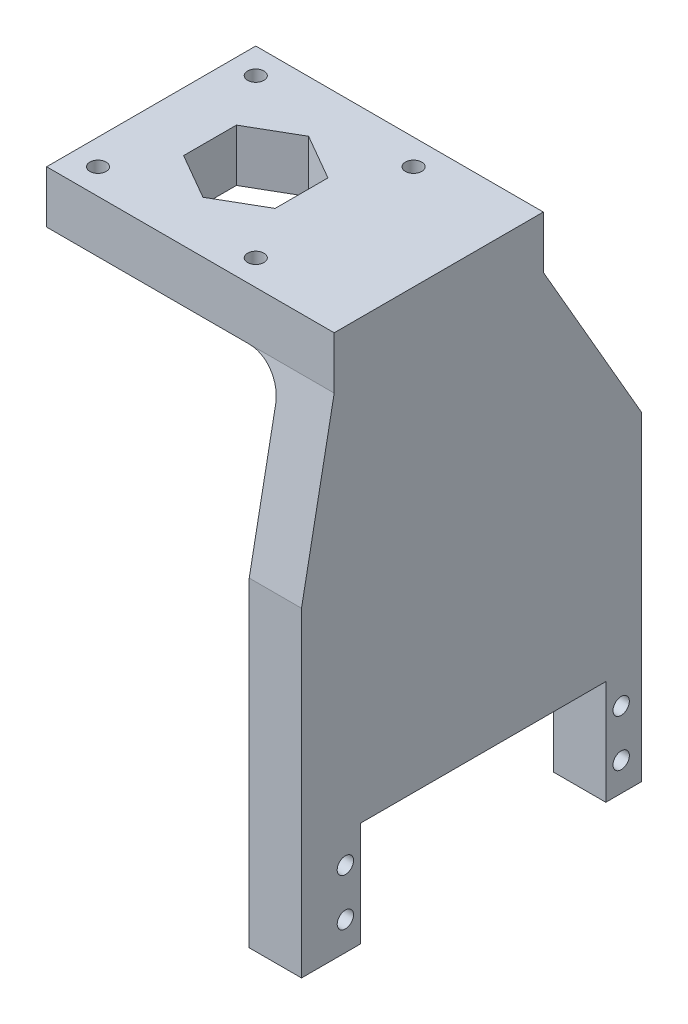
ISO-10303-21;
HEADER;
FILE_DESCRIPTION(('STEP AP214'),'2;1');
FILE_NAME('part.step','',(''),(''),'','','');
FILE_SCHEMA(('AUTOMOTIVE_DESIGN { 1 0 10303 214 1 1 1 1 }'));
ENDSEC;
DATA;
#1=APPLICATION_CONTEXT('core data for automotive mechanical design processes');
#2=APPLICATION_PROTOCOL_DEFINITION('international standard','automotive_design',2000,#1);
#3=PRODUCT_CONTEXT('',#1,'mechanical');
#4=PRODUCT('Part','Part','',(#3));
#5=PRODUCT_RELATED_PRODUCT_CATEGORY('part','',(#4));
#6=PRODUCT_DEFINITION_FORMATION('','',#4);
#7=PRODUCT_DEFINITION_CONTEXT('part definition',#1,'design');
#8=PRODUCT_DEFINITION('design','',#6,#7);
#9=PRODUCT_DEFINITION_SHAPE('','',#8);
#10=(LENGTH_UNIT() NAMED_UNIT(*) SI_UNIT(.MILLI.,.METRE.));
#11=(NAMED_UNIT(*) PLANE_ANGLE_UNIT() SI_UNIT($,.RADIAN.));
#12=(NAMED_UNIT(*) SI_UNIT($,.STERADIAN.) SOLID_ANGLE_UNIT());
#13=UNCERTAINTY_MEASURE_WITH_UNIT(LENGTH_MEASURE(1.E-05),#10,'distance_accuracy_value','');
#14=(GEOMETRIC_REPRESENTATION_CONTEXT(3) GLOBAL_UNCERTAINTY_ASSIGNED_CONTEXT((#13)) GLOBAL_UNIT_ASSIGNED_CONTEXT((#10,
#11,#12)) REPRESENTATION_CONTEXT('',''));
#15=CARTESIAN_POINT('',(0.,0.,0.));
#16=DIRECTION('',(0.,0.,1.));
#17=DIRECTION('',(1.,0.,0.));
#18=AXIS2_PLACEMENT_3D('',#15,#16,#17);
#19=CARTESIAN_POINT('',(0.,-75.,31.));
#20=DIRECTION('',(0.,1.,0.));
#21=DIRECTION('',(0.,0.,1.));
#22=AXIS2_PLACEMENT_3D('',#19,#20,#21);
#23=PLANE('',#22);
#24=DIRECTION('',(0.,0.,-1.));
#25=VECTOR('',#24,1.);
#26=CARTESIAN_POINT('',(8.00000000000001,-75.,31.));
#27=LINE('',#26,#25);
#28=CARTESIAN_POINT('',(8.00000000000001,-75.,21.));
#29=VERTEX_POINT('',#28);
#30=CARTESIAN_POINT('',(8.00000000000001,-75.,11.94));
#31=VERTEX_POINT('',#30);
#32=EDGE_CURVE('E358',#29,#31,#27,.T.);
#33=ORIENTED_EDGE('',*,*,#32,.F.);
#34=DIRECTION('',(-1.,0.,0.));
#35=VECTOR('',#34,1.);
#36=CARTESIAN_POINT('',(8.00100000000002,-75.,21.));
#37=LINE('',#36,#35);
#38=CARTESIAN_POINT('',(0.,-75.,21.));
#39=VERTEX_POINT('',#38);
#40=EDGE_CURVE('E187',#29,#39,#37,.T.);
#41=ORIENTED_EDGE('',*,*,#40,.T.);
#42=DIRECTION('',(0.,0.,-1.));
#43=VECTOR('',#42,1.);
#44=CARTESIAN_POINT('',(0.,-75.,31.));
#45=LINE('',#44,#43);
#46=CARTESIAN_POINT('',(0.,-75.,11.94));
#47=VERTEX_POINT('',#46);
#48=EDGE_CURVE('E361',#39,#47,#45,.T.);
#49=ORIENTED_EDGE('',*,*,#48,.T.);
#50=DIRECTION('',(-1.,0.,0.));
#51=VECTOR('',#50,1.);
#52=CARTESIAN_POINT('',(8.00100000000002,-75.,11.94));
#53=LINE('',#52,#51);
#54=EDGE_CURVE('E263',#31,#47,#53,.T.);
#55=ORIENTED_EDGE('',*,*,#54,.F.);
#56=EDGE_LOOP('',(#33,#41,#49,#55));
#57=FACE_BOUND('',#56,.T.);
#58=ADVANCED_FACE('F33',(#57),#23,.F.);
#59=CARTESIAN_POINT('',(-36.,8.,31.));
#60=DIRECTION('',(1.,0.,0.));
#61=DIRECTION('',(0.,0.,-1.));
#62=AXIS2_PLACEMENT_3D('',#59,#60,#61);
#63=PLANE('',#62);
#64=DIRECTION('',(0.,0.,-1.));
#65=VECTOR('',#64,1.);
#66=CARTESIAN_POINT('',(-36.,0.,31.));
#67=LINE('',#66,#65);
#68=CARTESIAN_POINT('',(-36.,0.,16.));
#69=VERTEX_POINT('',#68);
#70=CARTESIAN_POINT('',(-36.,0.,-16.));
#71=VERTEX_POINT('',#70);
#72=EDGE_CURVE('E363',#69,#71,#67,.T.);
#73=ORIENTED_EDGE('',*,*,#72,.F.);
#74=DIRECTION('',(0.,-1.,0.));
#75=VECTOR('',#74,1.);
#76=CARTESIAN_POINT('',(-36.,8.001,16.));
#77=LINE('',#76,#75);
#78=CARTESIAN_POINT('',(-36.,8.,16.));
#79=VERTEX_POINT('',#78);
#80=EDGE_CURVE('E213',#79,#69,#77,.T.);
#81=ORIENTED_EDGE('',*,*,#80,.F.);
#82=DIRECTION('',(0.,0.,-1.));
#83=VECTOR('',#82,1.);
#84=CARTESIAN_POINT('',(-36.,8.,31.));
#85=LINE('',#84,#83);
#86=CARTESIAN_POINT('',(-36.,8.,-16.));
#87=VERTEX_POINT('',#86);
#88=EDGE_CURVE('E354',#79,#87,#85,.T.);
#89=ORIENTED_EDGE('',*,*,#88,.T.);
#90=DIRECTION('',(0.,-1.,0.));
#91=VECTOR('',#90,1.);
#92=CARTESIAN_POINT('',(-36.,8.001,-16.));
#93=LINE('',#92,#91);
#94=EDGE_CURVE('E219',#87,#71,#93,.T.);
#95=ORIENTED_EDGE('',*,*,#94,.T.);
#96=EDGE_LOOP('',(#73,#81,#89,#95));
#97=FACE_BOUND('',#96,.T.);
#98=ADVANCED_FACE('F388',(#97),#63,.F.);
#99=CARTESIAN_POINT('',(-36.,0.,31.));
#100=DIRECTION('',(0.,1.,0.));
#101=DIRECTION('',(0.,0.,1.));
#102=AXIS2_PLACEMENT_3D('',#99,#100,#101);
#103=PLANE('',#102);
#104=CARTESIAN_POINT('',(-7.92968724514564,0.,12.0703127548544));
#105=DIRECTION('',(0.,1.,0.));
#106=DIRECTION('',(0.,0.,1.));
#107=AXIS2_PLACEMENT_3D('',#104,#105,#106);
#108=CIRCLE('',#107,1.25);
#109=CARTESIAN_POINT('',(-7.92968724514564,0.,13.3203127548544));
#110=VERTEX_POINT('',#109);
#111=EDGE_CURVE('E278',#110,#110,#108,.F.);
#112=ORIENTED_EDGE('',*,*,#111,.F.);
#113=EDGE_LOOP('',(#112));
#114=FACE_BOUND('',#113,.T.);
#115=CARTESIAN_POINT('',(-7.92968724514564,0.,-12.0703127548544));
#116=DIRECTION('',(0.,1.,0.));
#117=DIRECTION('',(0.,0.,1.));
#118=AXIS2_PLACEMENT_3D('',#115,#116,#117);
#119=CIRCLE('',#118,1.25);
#120=CARTESIAN_POINT('',(-7.92968724514564,0.,-10.8203127548544));
#121=VERTEX_POINT('',#120);
#122=EDGE_CURVE('E284',#121,#121,#119,.F.);
#123=ORIENTED_EDGE('',*,*,#122,.F.);
#124=EDGE_LOOP('',(#123));
#125=FACE_BOUND('',#124,.T.);
#126=CARTESIAN_POINT('',(-32.0703127548544,0.,-12.0703127548544));
#127=DIRECTION('',(0.,1.,0.));
#128=DIRECTION('',(0.,0.,1.));
#129=AXIS2_PLACEMENT_3D('',#126,#127,#128);
#130=CIRCLE('',#129,1.25);
#131=CARTESIAN_POINT('',(-32.0703127548544,0.,-10.8203127548544));
#132=VERTEX_POINT('',#131);
#133=EDGE_CURVE('E290',#132,#132,#130,.F.);
#134=ORIENTED_EDGE('',*,*,#133,.F.);
#135=EDGE_LOOP('',(#134));
#136=FACE_BOUND('',#135,.T.);
#137=CARTESIAN_POINT('',(-32.0703127548544,0.,12.0703127548544));
#138=DIRECTION('',(0.,1.,0.));
#139=DIRECTION('',(0.,0.,1.));
#140=AXIS2_PLACEMENT_3D('',#137,#138,#139);
#141=CIRCLE('',#140,1.25);
#142=CARTESIAN_POINT('',(-32.0703127548544,0.,13.3203127548544));
#143=VERTEX_POINT('',#142);
#144=EDGE_CURVE('E296',#143,#143,#141,.F.);
#145=ORIENTED_EDGE('',*,*,#144,.F.);
#146=EDGE_LOOP('',(#145));
#147=FACE_BOUND('',#146,.T.);
#148=DIRECTION('',(-0.866025403784439,0.,0.5));
#149=VECTOR('',#148,1.);
#150=CARTESIAN_POINT('',(-20.,0.,8.08290376865476));
#151=LINE('',#150,#149);
#152=CARTESIAN_POINT('',(-13.,0.,4.04145188432738));
#153=VERTEX_POINT('',#152);
#154=CARTESIAN_POINT('',(-20.,0.,8.08290376865476));
#155=VERTEX_POINT('',#154);
#156=EDGE_CURVE('E307',#153,#155,#151,.T.);
#157=ORIENTED_EDGE('',*,*,#156,.F.);
#158=DIRECTION('',(0.,0.,1.));
#159=VECTOR('',#158,1.);
#160=CARTESIAN_POINT('',(-13.,0.,4.04145188432738));
#161=LINE('',#160,#159);
#162=CARTESIAN_POINT('',(-13.,0.,-4.04145188432738));
#163=VERTEX_POINT('',#162);
#164=EDGE_CURVE('E310',#163,#153,#161,.T.);
#165=ORIENTED_EDGE('',*,*,#164,.F.);
#166=DIRECTION('',(0.866025403784439,0.,0.5));
#167=VECTOR('',#166,1.);
#168=CARTESIAN_POINT('',(-13.,0.,-4.04145188432738));
#169=LINE('',#168,#167);
#170=CARTESIAN_POINT('',(-20.,0.,-8.08290376865475));
#171=VERTEX_POINT('',#170);
#172=EDGE_CURVE('E333',#171,#163,#169,.T.);
#173=ORIENTED_EDGE('',*,*,#172,.F.);
#174=DIRECTION('',(0.866025403784439,0.,-0.5));
#175=VECTOR('',#174,1.);
#176=CARTESIAN_POINT('',(-20.,0.,-8.08290376865476));
#177=LINE('',#176,#175);
#178=CARTESIAN_POINT('',(-27.,0.,-4.04145188432738));
#179=VERTEX_POINT('',#178);
#180=EDGE_CURVE('E299',#179,#171,#177,.T.);
#181=ORIENTED_EDGE('',*,*,#180,.F.);
#182=DIRECTION('',(0.,0.,-1.));
#183=VECTOR('',#182,1.);
#184=CARTESIAN_POINT('',(-27.,0.,-4.04145188432738));
#185=LINE('',#184,#183);
#186=CARTESIAN_POINT('',(-27.,0.,4.04145188432738));
#187=VERTEX_POINT('',#186);
#188=EDGE_CURVE('E301',#187,#179,#185,.T.);
#189=ORIENTED_EDGE('',*,*,#188,.F.);
#190=DIRECTION('',(-0.866025403784439,0.,-0.5));
#191=VECTOR('',#190,1.);
#192=CARTESIAN_POINT('',(-27.,0.,4.04145188432738));
#193=LINE('',#192,#191);
#194=EDGE_CURVE('E304',#155,#187,#193,.T.);
#195=ORIENTED_EDGE('',*,*,#194,.F.);
#196=EDGE_LOOP('',(#157,#165,#173,#181,#189,#195));
#197=FACE_BOUND('',#196,.T.);
#198=DIRECTION('',(-1.,0.,0.));
#199=VECTOR('',#198,1.);
#200=CARTESIAN_POINT('',(0.,0.,-16.));
#201=LINE('',#200,#199);
#202=CARTESIAN_POINT('',(-5.,0.,-16.));
#203=VERTEX_POINT('',#202);
#204=EDGE_CURVE('E217',#203,#71,#201,.T.);
#205=ORIENTED_EDGE('',*,*,#204,.F.);
#206=DIRECTION('',(0.,0.,-1.));
#207=VECTOR('',#206,1.);
#208=CARTESIAN_POINT('',(-5.,0.,16.));
#209=LINE('',#208,#207);
#210=CARTESIAN_POINT('',(-5.,0.,16.));
#211=VERTEX_POINT('',#210);
#212=EDGE_CURVE('E369',#203,#211,#209,.F.);
#213=ORIENTED_EDGE('',*,*,#212,.T.);
#214=DIRECTION('',(1.,0.,0.));
#215=VECTOR('',#214,1.);
#216=CARTESIAN_POINT('',(-36.,0.,16.));
#217=LINE('',#216,#215);
#218=EDGE_CURVE('E172',#69,#211,#217,.T.);
#219=ORIENTED_EDGE('',*,*,#218,.F.);
#220=ORIENTED_EDGE('',*,*,#72,.T.);
#221=EDGE_LOOP('',(#205,#213,#219,#220));
#222=FACE_BOUND('',#221,.T.);
#223=ADVANCED_FACE('F378',(#114,#125,#136,#147,#197,#222),#103,.F.);
#224=CARTESIAN_POINT('',(0.,0.,31.));
#225=DIRECTION('',(1.,0.,0.));
#226=DIRECTION('',(0.,1.,0.));
#227=AXIS2_PLACEMENT_3D('',#224,#225,#226);
#228=PLANE('',#227);
#229=CARTESIAN_POINT('',(0.,-70.6,-27.91));
#230=DIRECTION('',(-1.,0.,0.));
#231=DIRECTION('',(0.,1.,0.));
#232=AXIS2_PLACEMENT_3D('',#229,#230,#231);
#233=CIRCLE('',#232,1.25);
#234=CARTESIAN_POINT('',(0.,-69.35,-27.91));
#235=VERTEX_POINT('',#234);
#236=EDGE_CURVE('E225',#235,#235,#233,.T.);
#237=ORIENTED_EDGE('',*,*,#236,.F.);
#238=EDGE_LOOP('',(#237));
#239=FACE_BOUND('',#238,.T.);
#240=CARTESIAN_POINT('',(0.,-63.4,-27.91));
#241=DIRECTION('',(-1.,0.,0.));
#242=DIRECTION('',(0.,-1.,0.));
#243=AXIS2_PLACEMENT_3D('',#240,#241,#242);
#244=CIRCLE('',#243,1.25);
#245=CARTESIAN_POINT('',(0.,-64.65,-27.91));
#246=VERTEX_POINT('',#245);
#247=EDGE_CURVE('E231',#246,#246,#244,.T.);
#248=ORIENTED_EDGE('',*,*,#247,.F.);
#249=EDGE_LOOP('',(#248));
#250=FACE_BOUND('',#249,.T.);
#251=CARTESIAN_POINT('',(0.,-63.4,14.29));
#252=DIRECTION('',(-1.,0.,0.));
#253=DIRECTION('',(0.,1.,0.));
#254=AXIS2_PLACEMENT_3D('',#251,#252,#253);
#255=CIRCLE('',#254,1.25);
#256=CARTESIAN_POINT('',(0.,-62.15,14.29));
#257=VERTEX_POINT('',#256);
#258=EDGE_CURVE('E237',#257,#257,#255,.T.);
#259=ORIENTED_EDGE('',*,*,#258,.F.);
#260=EDGE_LOOP('',(#259));
#261=FACE_BOUND('',#260,.T.);
#262=CARTESIAN_POINT('',(0.,-70.6,14.29));
#263=DIRECTION('',(-1.,0.,0.));
#264=DIRECTION('',(0.,-1.,0.));
#265=AXIS2_PLACEMENT_3D('',#262,#263,#264);
#266=CIRCLE('',#265,1.25);
#267=CARTESIAN_POINT('',(0.,-71.85,14.29));
#268=VERTEX_POINT('',#267);
#269=EDGE_CURVE('E243',#268,#268,#266,.T.);
#270=ORIENTED_EDGE('',*,*,#269,.F.);
#271=EDGE_LOOP('',(#270));
#272=FACE_BOUND('',#271,.T.);
#273=DIRECTION('',(0.,-0.982006446980647,0.188847393650125));
#274=VECTOR('',#273,1.);
#275=CARTESIAN_POINT('',(0.,0.,16.));
#276=LINE('',#275,#274);
#277=CARTESIAN_POINT('',(0.,-5.,16.9615384615385));
#278=VERTEX_POINT('',#277);
#279=CARTESIAN_POINT('',(0.,-26.,21.));
#280=VERTEX_POINT('',#279);
#281=EDGE_CURVE('E193',#278,#280,#276,.T.);
#282=ORIENTED_EDGE('',*,*,#281,.F.);
#283=DIRECTION('',(0.,0.,-1.));
#284=VECTOR('',#283,1.);
#285=CARTESIAN_POINT('',(0.,-5.,-16.));
#286=LINE('',#285,#284);
#287=CARTESIAN_POINT('',(0.,-5.,-18.8846153846154));
#288=VERTEX_POINT('',#287);
#289=EDGE_CURVE('E366',#278,#288,#286,.T.);
#290=ORIENTED_EDGE('',*,*,#289,.T.);
#291=DIRECTION('',(0.,0.8661855860486,0.499722453489577));
#292=VECTOR('',#291,1.);
#293=CARTESIAN_POINT('',(0.,0.,-16.));
#294=LINE('',#293,#292);
#295=CARTESIAN_POINT('',(0.,-26.,-31.));
#296=VERTEX_POINT('',#295);
#297=EDGE_CURVE('E206',#296,#288,#294,.T.);
#298=ORIENTED_EDGE('',*,*,#297,.F.);
#299=DIRECTION('',(0.,-1.,0.));
#300=VECTOR('',#299,1.);
#301=CARTESIAN_POINT('',(0.,0.,-31.));
#302=LINE('',#301,#300);
#303=CARTESIAN_POINT('',(0.,-75.,-31.));
#304=VERTEX_POINT('',#303);
#305=EDGE_CURVE('E346',#296,#304,#302,.T.);
#306=ORIENTED_EDGE('',*,*,#305,.T.);
#307=CARTESIAN_POINT('',(0.,-75.,-25.56));
#308=VERTEX_POINT('',#307);
#309=EDGE_CURVE('E360',#308,#304,#45,.T.);
#310=ORIENTED_EDGE('',*,*,#309,.F.);
#311=DIRECTION('',(0.,-1.,0.));
#312=VECTOR('',#311,1.);
#313=CARTESIAN_POINT('',(0.,-75.,-25.56));
#314=LINE('',#313,#312);
#315=CARTESIAN_POINT('',(0.,-59.,-25.56));
#316=VERTEX_POINT('',#315);
#317=EDGE_CURVE('E260',#316,#308,#314,.T.);
#318=ORIENTED_EDGE('',*,*,#317,.F.);
#319=DIRECTION('',(0.,0.,-1.));
#320=VECTOR('',#319,1.);
#321=CARTESIAN_POINT('',(0.,-59.,11.94));
#322=LINE('',#321,#320);
#323=CARTESIAN_POINT('',(0.,-59.,11.94));
#324=VERTEX_POINT('',#323);
#325=EDGE_CURVE('E257',#324,#316,#322,.T.);
#326=ORIENTED_EDGE('',*,*,#325,.F.);
#327=DIRECTION('',(0.,1.,0.));
#328=VECTOR('',#327,1.);
#329=CARTESIAN_POINT('',(0.,-75.,11.94));
#330=LINE('',#329,#328);
#331=EDGE_CURVE('E254',#47,#324,#330,.T.);
#332=ORIENTED_EDGE('',*,*,#331,.F.);
#333=ORIENTED_EDGE('',*,*,#48,.F.);
#334=DIRECTION('',(0.,-1.,0.));
#335=VECTOR('',#334,1.);
#336=CARTESIAN_POINT('',(0.,-26.,21.));
#337=LINE('',#336,#335);
#338=EDGE_CURVE('E177',#280,#39,#337,.T.);
#339=ORIENTED_EDGE('',*,*,#338,.F.);
#340=EDGE_LOOP('',(#282,#290,#298,#306,#310,#318,#326,#332,#333,#339));
#341=FACE_BOUND('',#340,.T.);
#342=ADVANCED_FACE('F394',(#239,#250,#261,#272,#341),#228,.F.);
#343=CARTESIAN_POINT('',(8.00000000000001,-75.,-25.56));
#344=VERTEX_POINT('',#343);
#345=CARTESIAN_POINT('',(8.00000000000001,-75.,-31.));
#346=VERTEX_POINT('',#345);
#347=EDGE_CURVE('E357',#344,#346,#27,.T.);
#348=ORIENTED_EDGE('',*,*,#347,.F.);
#349=DIRECTION('',(-1.,0.,0.));
#350=VECTOR('',#349,1.);
#351=CARTESIAN_POINT('',(8.00100000000002,-75.,-25.56));
#352=LINE('',#351,#350);
#353=EDGE_CURVE('E267',#344,#308,#352,.T.);
#354=ORIENTED_EDGE('',*,*,#353,.T.);
#355=ORIENTED_EDGE('',*,*,#309,.T.);
#356=DIRECTION('',(1.,0.,0.));
#357=VECTOR('',#356,1.);
#358=CARTESIAN_POINT('',(0.,-75.,-31.));
#359=LINE('',#358,#357);
#360=EDGE_CURVE('E348',#304,#346,#359,.T.);
#361=ORIENTED_EDGE('',*,*,#360,.T.);
#362=EDGE_LOOP('',(#348,#354,#355,#361));
#363=FACE_BOUND('',#362,.T.);
#364=ADVANCED_FACE('F399',(#363),#23,.F.);
#365=CARTESIAN_POINT('',(8.00000000000001,-75.,31.));
#366=DIRECTION('',(-1.,0.,0.));
#367=DIRECTION('',(0.,-1.,0.));
#368=AXIS2_PLACEMENT_3D('',#365,#366,#367);
#369=PLANE('',#368);
#370=DIRECTION('',(0.,0.,-1.));
#371=VECTOR('',#370,1.);
#372=CARTESIAN_POINT('',(8.00000000000001,8.00000000000001,31.));
#373=LINE('',#372,#371);
#374=CARTESIAN_POINT('',(8.00000000000001,8.,16.));
#375=VERTEX_POINT('',#374);
#376=CARTESIAN_POINT('',(8.00000000000001,8.00000000000001,-16.));
#377=VERTEX_POINT('',#376);
#378=EDGE_CURVE('E192',#375,#377,#373,.T.);
#379=ORIENTED_EDGE('',*,*,#378,.F.);
#380=DIRECTION('',(0.,1.,0.));
#381=VECTOR('',#380,1.);
#382=CARTESIAN_POINT('',(8.00000000000001,8.,16.));
#383=LINE('',#382,#381);
#384=CARTESIAN_POINT('',(8.00000000000001,0.,16.));
#385=VERTEX_POINT('',#384);
#386=EDGE_CURVE('E169',#385,#375,#383,.T.);
#387=ORIENTED_EDGE('',*,*,#386,.F.);
#388=DIRECTION('',(0.,0.982006446980647,-0.188847393650125));
#389=VECTOR('',#388,1.);
#390=CARTESIAN_POINT('',(8.00000000000001,0.,16.));
#391=LINE('',#390,#389);
#392=CARTESIAN_POINT('',(8.00000000000001,-26.,21.));
#393=VERTEX_POINT('',#392);
#394=EDGE_CURVE('E180',#393,#385,#391,.T.);
#395=ORIENTED_EDGE('',*,*,#394,.F.);
#396=DIRECTION('',(0.,1.,0.));
#397=VECTOR('',#396,1.);
#398=CARTESIAN_POINT('',(8.00000000000001,-26.,21.));
#399=LINE('',#398,#397);
#400=EDGE_CURVE('E194',#29,#393,#399,.T.);
#401=ORIENTED_EDGE('',*,*,#400,.F.);
#402=ORIENTED_EDGE('',*,*,#32,.T.);
#403=DIRECTION('',(0.,-1.,0.));
#404=VECTOR('',#403,1.);
#405=CARTESIAN_POINT('',(8.00000000000001,-75.,11.94));
#406=LINE('',#405,#404);
#407=CARTESIAN_POINT('',(8.00000000000001,-59.,11.94));
#408=VERTEX_POINT('',#407);
#409=EDGE_CURVE('E251',#408,#31,#406,.T.);
#410=ORIENTED_EDGE('',*,*,#409,.F.);
#411=DIRECTION('',(0.,0.,1.));
#412=VECTOR('',#411,1.);
#413=CARTESIAN_POINT('',(8.00000000000001,-59.,11.94));
#414=LINE('',#413,#412);
#415=CARTESIAN_POINT('',(8.00000000000001,-59.,-25.56));
#416=VERTEX_POINT('',#415);
#417=EDGE_CURVE('E266',#416,#408,#414,.T.);
#418=ORIENTED_EDGE('',*,*,#417,.F.);
#419=DIRECTION('',(0.,1.,0.));
#420=VECTOR('',#419,1.);
#421=CARTESIAN_POINT('',(8.00000000000001,-75.,-25.56));
#422=LINE('',#421,#420);
#423=EDGE_CURVE('E249',#344,#416,#422,.T.);
#424=ORIENTED_EDGE('',*,*,#423,.F.);
#425=ORIENTED_EDGE('',*,*,#347,.T.);
#426=DIRECTION('',(0.,1.,0.));
#427=VECTOR('',#426,1.);
#428=CARTESIAN_POINT('',(8.00000000000001,-75.,-31.));
#429=LINE('',#428,#427);
#430=CARTESIAN_POINT('',(8.00000000000001,-26.,-31.));
#431=VERTEX_POINT('',#430);
#432=EDGE_CURVE('E351',#346,#431,#429,.T.);
#433=ORIENTED_EDGE('',*,*,#432,.T.);
#434=DIRECTION('',(0.,-0.8661855860486,-0.499722453489577));
#435=VECTOR('',#434,1.);
#436=CARTESIAN_POINT('',(8.00000000000001,0.,-16.));
#437=LINE('',#436,#435);
#438=CARTESIAN_POINT('',(8.00000000000001,0.,-16.));
#439=VERTEX_POINT('',#438);
#440=EDGE_CURVE('E186',#439,#431,#437,.T.);
#441=ORIENTED_EDGE('',*,*,#440,.F.);
#442=DIRECTION('',(0.,-1.,0.));
#443=VECTOR('',#442,1.);
#444=CARTESIAN_POINT('',(8.00000000000001,0.,-16.));
#445=LINE('',#444,#443);
#446=EDGE_CURVE('E204',#377,#439,#445,.T.);
#447=ORIENTED_EDGE('',*,*,#446,.F.);
#448=EDGE_LOOP('',(#379,#387,#395,#401,#402,#410,#418,#424,#425,#433,#441,#447));
#449=FACE_BOUND('',#448,.T.);
#450=CARTESIAN_POINT('',(8.00000000000001,-70.6,-27.91));
#451=DIRECTION('',(-1.,0.,0.));
#452=DIRECTION('',(0.,-1.,0.));
#453=AXIS2_PLACEMENT_3D('',#450,#451,#452);
#454=CIRCLE('',#453,1.25);
#455=CARTESIAN_POINT('',(8.00000000000001,-71.85,-27.91));
#456=VERTEX_POINT('',#455);
#457=EDGE_CURVE('E228',#456,#456,#454,.F.);
#458=ORIENTED_EDGE('',*,*,#457,.F.);
#459=EDGE_LOOP('',(#458));
#460=FACE_BOUND('',#459,.T.);
#461=CARTESIAN_POINT('',(8.00000000000001,-63.4,-27.91));
#462=DIRECTION('',(-1.,0.,0.));
#463=DIRECTION('',(0.,-1.,0.));
#464=AXIS2_PLACEMENT_3D('',#461,#462,#463);
#465=CIRCLE('',#464,1.25);
#466=CARTESIAN_POINT('',(8.00000000000001,-64.65,-27.91));
#467=VERTEX_POINT('',#466);
#468=EDGE_CURVE('E234',#467,#467,#465,.F.);
#469=ORIENTED_EDGE('',*,*,#468,.F.);
#470=EDGE_LOOP('',(#469));
#471=FACE_BOUND('',#470,.T.);
#472=CARTESIAN_POINT('',(8.00000000000001,-63.4,14.29));
#473=DIRECTION('',(-1.,0.,0.));
#474=DIRECTION('',(0.,-1.,0.));
#475=AXIS2_PLACEMENT_3D('',#472,#473,#474);
#476=CIRCLE('',#475,1.25);
#477=CARTESIAN_POINT('',(8.00000000000001,-64.65,14.29));
#478=VERTEX_POINT('',#477);
#479=EDGE_CURVE('E240',#478,#478,#476,.F.);
#480=ORIENTED_EDGE('',*,*,#479,.F.);
#481=EDGE_LOOP('',(#480));
#482=FACE_BOUND('',#481,.T.);
#483=CARTESIAN_POINT('',(8.00000000000001,-70.6,14.29));
#484=DIRECTION('',(-1.,0.,0.));
#485=DIRECTION('',(0.,-1.,0.));
#486=AXIS2_PLACEMENT_3D('',#483,#484,#485);
#487=CIRCLE('',#486,1.25);
#488=CARTESIAN_POINT('',(8.00000000000001,-71.85,14.29));
#489=VERTEX_POINT('',#488);
#490=EDGE_CURVE('E246',#489,#489,#487,.F.);
#491=ORIENTED_EDGE('',*,*,#490,.F.);
#492=EDGE_LOOP('',(#491));
#493=FACE_BOUND('',#492,.T.);
#494=ADVANCED_FACE('F189',(#449,#460,#471,#482,#493),#369,.F.);
#495=CARTESIAN_POINT('',(8.00000000000001,8.00000000000001,31.));
#496=DIRECTION('',(0.,-1.,0.));
#497=DIRECTION('',(1.,0.,0.));
#498=AXIS2_PLACEMENT_3D('',#495,#496,#497);
#499=PLANE('',#498);
#500=CARTESIAN_POINT('',(-7.92968724514564,8.,12.0703127548544));
#501=DIRECTION('',(0.,1.,0.));
#502=DIRECTION('',(-1.,0.,0.));
#503=AXIS2_PLACEMENT_3D('',#500,#501,#502);
#504=CIRCLE('',#503,1.25);
#505=CARTESIAN_POINT('',(-9.17968724514564,8.,12.0703127548544));
#506=VERTEX_POINT('',#505);
#507=EDGE_CURVE('E275',#506,#506,#504,.T.);
#508=ORIENTED_EDGE('',*,*,#507,.F.);
#509=EDGE_LOOP('',(#508));
#510=FACE_BOUND('',#509,.T.);
#511=CARTESIAN_POINT('',(-7.92968724514564,8.,-12.0703127548544));
#512=DIRECTION('',(0.,1.,0.));
#513=DIRECTION('',(-1.,0.,0.));
#514=AXIS2_PLACEMENT_3D('',#511,#512,#513);
#515=CIRCLE('',#514,1.25);
#516=CARTESIAN_POINT('',(-9.17968724514564,8.,-12.0703127548544));
#517=VERTEX_POINT('',#516);
#518=EDGE_CURVE('E281',#517,#517,#515,.T.);
#519=ORIENTED_EDGE('',*,*,#518,.F.);
#520=EDGE_LOOP('',(#519));
#521=FACE_BOUND('',#520,.T.);
#522=CARTESIAN_POINT('',(-32.0703127548544,8.,-12.0703127548544));
#523=DIRECTION('',(0.,1.,0.));
#524=DIRECTION('',(-1.,0.,0.));
#525=AXIS2_PLACEMENT_3D('',#522,#523,#524);
#526=CIRCLE('',#525,1.25);
#527=CARTESIAN_POINT('',(-33.3203127548544,8.,-12.0703127548544));
#528=VERTEX_POINT('',#527);
#529=EDGE_CURVE('E287',#528,#528,#526,.T.);
#530=ORIENTED_EDGE('',*,*,#529,.F.);
#531=EDGE_LOOP('',(#530));
#532=FACE_BOUND('',#531,.T.);
#533=CARTESIAN_POINT('',(-32.0703127548544,8.,12.0703127548544));
#534=DIRECTION('',(0.,1.,0.));
#535=DIRECTION('',(-1.,0.,0.));
#536=AXIS2_PLACEMENT_3D('',#533,#534,#535);
#537=CIRCLE('',#536,1.25);
#538=CARTESIAN_POINT('',(-33.3203127548544,8.,12.0703127548544));
#539=VERTEX_POINT('',#538);
#540=EDGE_CURVE('E293',#539,#539,#537,.T.);
#541=ORIENTED_EDGE('',*,*,#540,.F.);
#542=EDGE_LOOP('',(#541));
#543=FACE_BOUND('',#542,.T.);
#544=DIRECTION('',(-0.866025403784438,0.,-0.5));
#545=VECTOR('',#544,1.);
#546=CARTESIAN_POINT('',(-13.,8.,-4.04145188432738));
#547=LINE('',#546,#545);
#548=CARTESIAN_POINT('',(-13.,8.,-4.04145188432737));
#549=VERTEX_POINT('',#548);
#550=CARTESIAN_POINT('',(-20.,8.,-8.08290376865476));
#551=VERTEX_POINT('',#550);
#552=EDGE_CURVE('E315',#549,#551,#547,.T.);
#553=ORIENTED_EDGE('',*,*,#552,.F.);
#554=DIRECTION('',(0.,0.,-1.));
#555=VECTOR('',#554,1.);
#556=CARTESIAN_POINT('',(-13.,8.,4.04145188432738));
#557=LINE('',#556,#555);
#558=CARTESIAN_POINT('',(-13.,8.,4.04145188432738));
#559=VERTEX_POINT('',#558);
#560=EDGE_CURVE('E313',#559,#549,#557,.T.);
#561=ORIENTED_EDGE('',*,*,#560,.F.);
#562=DIRECTION('',(0.866025403784438,0.,-0.5));
#563=VECTOR('',#562,1.);
#564=CARTESIAN_POINT('',(-20.,8.,8.08290376865476));
#565=LINE('',#564,#563);
#566=CARTESIAN_POINT('',(-20.,8.,8.08290376865476));
#567=VERTEX_POINT('',#566);
#568=EDGE_CURVE('E327',#567,#559,#565,.T.);
#569=ORIENTED_EDGE('',*,*,#568,.F.);
#570=DIRECTION('',(0.866025403784439,0.,0.5));
#571=VECTOR('',#570,1.);
#572=CARTESIAN_POINT('',(-27.,8.,4.04145188432738));
#573=LINE('',#572,#571);
#574=CARTESIAN_POINT('',(-27.,8.,4.04145188432738));
#575=VERTEX_POINT('',#574);
#576=EDGE_CURVE('E324',#575,#567,#573,.T.);
#577=ORIENTED_EDGE('',*,*,#576,.F.);
#578=DIRECTION('',(0.,0.,1.));
#579=VECTOR('',#578,1.);
#580=CARTESIAN_POINT('',(-27.,8.,-4.04145188432738));
#581=LINE('',#580,#579);
#582=CARTESIAN_POINT('',(-27.,8.,-4.04145188432738));
#583=VERTEX_POINT('',#582);
#584=EDGE_CURVE('E321',#583,#575,#581,.T.);
#585=ORIENTED_EDGE('',*,*,#584,.F.);
#586=DIRECTION('',(-0.866025403784439,0.,0.5));
#587=VECTOR('',#586,1.);
#588=CARTESIAN_POINT('',(-20.,8.,-8.08290376865476));
#589=LINE('',#588,#587);
#590=EDGE_CURVE('E318',#551,#583,#589,.T.);
#591=ORIENTED_EDGE('',*,*,#590,.F.);
#592=EDGE_LOOP('',(#553,#561,#569,#577,#585,#591));
#593=FACE_BOUND('',#592,.T.);
#594=DIRECTION('',(-1.,0.,0.));
#595=VECTOR('',#594,1.);
#596=CARTESIAN_POINT('',(-36.,8.,16.));
#597=LINE('',#596,#595);
#598=EDGE_CURVE('E215',#375,#79,#597,.T.);
#599=ORIENTED_EDGE('',*,*,#598,.F.);
#600=ORIENTED_EDGE('',*,*,#378,.T.);
#601=DIRECTION('',(1.,0.,0.));
#602=VECTOR('',#601,1.);
#603=CARTESIAN_POINT('',(0.,8.,-16.));
#604=LINE('',#603,#602);
#605=EDGE_CURVE('E222',#87,#377,#604,.T.);
#606=ORIENTED_EDGE('',*,*,#605,.F.);
#607=ORIENTED_EDGE('',*,*,#88,.F.);
#608=EDGE_LOOP('',(#599,#600,#606,#607));
#609=FACE_BOUND('',#608,.T.);
#610=ADVANCED_FACE('F386',(#510,#521,#532,#543,#593,#609),#499,.F.);
#611=CARTESIAN_POINT('',(0.,0.,-31.));
#612=DIRECTION('',(0.,0.,1.));
#613=DIRECTION('',(1.,0.,0.));
#614=AXIS2_PLACEMENT_3D('',#611,#612,#613);
#615=PLANE('',#614);
#616=ORIENTED_EDGE('',*,*,#305,.F.);
#617=DIRECTION('',(-1.,0.,0.));
#618=VECTOR('',#617,1.);
#619=CARTESIAN_POINT('',(8.00100000000001,-26.,-31.));
#620=LINE('',#619,#618);
#621=EDGE_CURVE('E209',#431,#296,#620,.T.);
#622=ORIENTED_EDGE('',*,*,#621,.F.);
#623=ORIENTED_EDGE('',*,*,#432,.F.);
#624=ORIENTED_EDGE('',*,*,#360,.F.);
#625=EDGE_LOOP('',(#616,#622,#623,#624));
#626=FACE_BOUND('',#625,.T.);
#627=ADVANCED_FACE('F410',(#626),#615,.F.);
#628=CARTESIAN_POINT('',(-13.,-75.001,4.04145188432738));
#629=DIRECTION('',(1.,0.,0.));
#630=DIRECTION('',(0.,1.,0.));
#631=AXIS2_PLACEMENT_3D('',#628,#629,#630);
#632=PLANE('',#631);
#633=ORIENTED_EDGE('',*,*,#164,.T.);
#634=DIRECTION('',(0.,1.,0.));
#635=VECTOR('',#634,1.);
#636=CARTESIAN_POINT('',(-13.,-75.001,4.04145188432738));
#637=LINE('',#636,#635);
#638=EDGE_CURVE('E331',#153,#559,#637,.T.);
#639=ORIENTED_EDGE('',*,*,#638,.T.);
#640=ORIENTED_EDGE('',*,*,#560,.T.);
#641=DIRECTION('',(0.,1.,0.));
#642=VECTOR('',#641,1.);
#643=CARTESIAN_POINT('',(-13.,-75.001,-4.04145188432738));
#644=LINE('',#643,#642);
#645=EDGE_CURVE('E330',#163,#549,#644,.T.);
#646=ORIENTED_EDGE('',*,*,#645,.F.);
#647=EDGE_LOOP('',(#633,#639,#640,#646));
#648=FACE_BOUND('',#647,.T.);
#649=ADVANCED_FACE('F414',(#648),#632,.F.);
#650=CARTESIAN_POINT('',(-20.,-75.001,8.08290376865476));
#651=DIRECTION('',(0.5,0.,0.866025403784439));
#652=DIRECTION('',(0.866025403784439,0.,-0.5));
#653=AXIS2_PLACEMENT_3D('',#650,#651,#652);
#654=PLANE('',#653);
#655=ORIENTED_EDGE('',*,*,#156,.T.);
#656=DIRECTION('',(0.,1.,0.));
#657=VECTOR('',#656,1.);
#658=CARTESIAN_POINT('',(-20.,-75.001,8.08290376865476));
#659=LINE('',#658,#657);
#660=EDGE_CURVE('E334',#155,#567,#659,.T.);
#661=ORIENTED_EDGE('',*,*,#660,.T.);
#662=ORIENTED_EDGE('',*,*,#568,.T.);
#663=ORIENTED_EDGE('',*,*,#638,.F.);
#664=EDGE_LOOP('',(#655,#661,#662,#663));
#665=FACE_BOUND('',#664,.T.);
#666=ADVANCED_FACE('F418',(#665),#654,.F.);
#667=CARTESIAN_POINT('',(-27.,-75.001,4.04145188432738));
#668=DIRECTION('',(-0.5,0.,0.866025403784439));
#669=DIRECTION('',(0.866025403784439,0.,0.5));
#670=AXIS2_PLACEMENT_3D('',#667,#668,#669);
#671=PLANE('',#670);
#672=ORIENTED_EDGE('',*,*,#194,.T.);
#673=DIRECTION('',(0.,1.,0.));
#674=VECTOR('',#673,1.);
#675=CARTESIAN_POINT('',(-27.,-75.001,4.04145188432738));
#676=LINE('',#675,#674);
#677=EDGE_CURVE('E336',#187,#575,#676,.T.);
#678=ORIENTED_EDGE('',*,*,#677,.T.);
#679=ORIENTED_EDGE('',*,*,#576,.T.);
#680=ORIENTED_EDGE('',*,*,#660,.F.);
#681=EDGE_LOOP('',(#672,#678,#679,#680));
#682=FACE_BOUND('',#681,.T.);
#683=ADVANCED_FACE('F432',(#682),#671,.F.);
#684=CARTESIAN_POINT('',(-27.,-75.001,-4.04145188432738));
#685=DIRECTION('',(-1.,0.,0.));
#686=DIRECTION('',(0.,0.,1.));
#687=AXIS2_PLACEMENT_3D('',#684,#685,#686);
#688=PLANE('',#687);
#689=ORIENTED_EDGE('',*,*,#188,.T.);
#690=DIRECTION('',(0.,1.,0.));
#691=VECTOR('',#690,1.);
#692=CARTESIAN_POINT('',(-27.,-75.001,-4.04145188432738));
#693=LINE('',#692,#691);
#694=EDGE_CURVE('E338',#179,#583,#693,.T.);
#695=ORIENTED_EDGE('',*,*,#694,.T.);
#696=ORIENTED_EDGE('',*,*,#584,.T.);
#697=ORIENTED_EDGE('',*,*,#677,.F.);
#698=EDGE_LOOP('',(#689,#695,#696,#697));
#699=FACE_BOUND('',#698,.T.);
#700=ADVANCED_FACE('F428',(#699),#688,.F.);
#701=CARTESIAN_POINT('',(-20.,-75.001,-8.08290376865476));
#702=DIRECTION('',(-0.5,0.,-0.866025403784439));
#703=DIRECTION('',(-0.866025403784439,0.,0.5));
#704=AXIS2_PLACEMENT_3D('',#701,#702,#703);
#705=PLANE('',#704);
#706=ORIENTED_EDGE('',*,*,#180,.T.);
#707=DIRECTION('',(0.,1.,0.));
#708=VECTOR('',#707,1.);
#709=CARTESIAN_POINT('',(-20.,-75.001,-8.08290376865476));
#710=LINE('',#709,#708);
#711=EDGE_CURVE('E340',#171,#551,#710,.T.);
#712=ORIENTED_EDGE('',*,*,#711,.T.);
#713=ORIENTED_EDGE('',*,*,#590,.T.);
#714=ORIENTED_EDGE('',*,*,#694,.F.);
#715=EDGE_LOOP('',(#706,#712,#713,#714));
#716=FACE_BOUND('',#715,.T.);
#717=ADVANCED_FACE('F424',(#716),#705,.F.);
#718=CARTESIAN_POINT('',(-13.,-75.001,-4.04145188432738));
#719=DIRECTION('',(0.5,0.,-0.866025403784438));
#720=DIRECTION('',(-0.866025403784439,0.,-0.5));
#721=AXIS2_PLACEMENT_3D('',#718,#719,#720);
#722=PLANE('',#721);
#723=ORIENTED_EDGE('',*,*,#172,.T.);
#724=ORIENTED_EDGE('',*,*,#645,.T.);
#725=ORIENTED_EDGE('',*,*,#552,.T.);
#726=ORIENTED_EDGE('',*,*,#711,.F.);
#727=EDGE_LOOP('',(#723,#724,#725,#726));
#728=FACE_BOUND('',#727,.T.);
#729=ADVANCED_FACE('F420',(#728),#722,.F.);
#730=CARTESIAN_POINT('',(-32.0703127548544,-75.001,12.0703127548544));
#731=DIRECTION('',(0.,1.,0.));
#732=DIRECTION('',(-1.,0.,0.));
#733=AXIS2_PLACEMENT_3D('',#730,#731,#732);
#734=CYLINDRICAL_SURFACE('',#733,1.25);
#735=ORIENTED_EDGE('',*,*,#540,.T.);
#736=EDGE_LOOP('',(#735));
#737=FACE_BOUND('',#736,.T.);
#738=ORIENTED_EDGE('',*,*,#144,.T.);
#739=EDGE_LOOP('',(#738));
#740=FACE_BOUND('',#739,.T.);
#741=ADVANCED_FACE('F423',(#737,#740),#734,.F.);
#742=CARTESIAN_POINT('',(-32.0703127548544,-75.001,-12.0703127548544));
#743=DIRECTION('',(0.,1.,0.));
#744=DIRECTION('',(-1.,0.,0.));
#745=AXIS2_PLACEMENT_3D('',#742,#743,#744);
#746=CYLINDRICAL_SURFACE('',#745,1.25);
#747=ORIENTED_EDGE('',*,*,#529,.T.);
#748=EDGE_LOOP('',(#747));
#749=FACE_BOUND('',#748,.T.);
#750=ORIENTED_EDGE('',*,*,#133,.T.);
#751=EDGE_LOOP('',(#750));
#752=FACE_BOUND('',#751,.T.);
#753=ADVANCED_FACE('F442',(#749,#752),#746,.F.);
#754=CARTESIAN_POINT('',(-7.92968724514563,-75.001,-12.0703127548544));
#755=DIRECTION('',(0.,1.,0.));
#756=DIRECTION('',(-1.,0.,0.));
#757=AXIS2_PLACEMENT_3D('',#754,#755,#756);
#758=CYLINDRICAL_SURFACE('',#757,1.25);
#759=ORIENTED_EDGE('',*,*,#518,.T.);
#760=EDGE_LOOP('',(#759));
#761=FACE_BOUND('',#760,.T.);
#762=ORIENTED_EDGE('',*,*,#122,.T.);
#763=EDGE_LOOP('',(#762));
#764=FACE_BOUND('',#763,.T.);
#765=ADVANCED_FACE('F446',(#761,#764),#758,.F.);
#766=CARTESIAN_POINT('',(-7.92968724514564,-75.001,12.0703127548544));
#767=DIRECTION('',(0.,1.,0.));
#768=DIRECTION('',(-1.,0.,0.));
#769=AXIS2_PLACEMENT_3D('',#766,#767,#768);
#770=CYLINDRICAL_SURFACE('',#769,1.25);
#771=ORIENTED_EDGE('',*,*,#507,.T.);
#772=EDGE_LOOP('',(#771));
#773=FACE_BOUND('',#772,.T.);
#774=ORIENTED_EDGE('',*,*,#111,.T.);
#775=EDGE_LOOP('',(#774));
#776=FACE_BOUND('',#775,.T.);
#777=ADVANCED_FACE('F450',(#773,#776),#770,.F.);
#778=CARTESIAN_POINT('',(8.00100000000002,-75.,11.94));
#779=DIRECTION('',(0.,0.,1.));
#780=DIRECTION('',(1.,0.,0.));
#781=AXIS2_PLACEMENT_3D('',#778,#779,#780);
#782=PLANE('',#781);
#783=ORIENTED_EDGE('',*,*,#409,.T.);
#784=ORIENTED_EDGE('',*,*,#54,.T.);
#785=ORIENTED_EDGE('',*,*,#331,.T.);
#786=DIRECTION('',(-1.,0.,0.));
#787=VECTOR('',#786,1.);
#788=CARTESIAN_POINT('',(8.00100000000002,-59.,11.94));
#789=LINE('',#788,#787);
#790=EDGE_CURVE('E262',#408,#324,#789,.T.);
#791=ORIENTED_EDGE('',*,*,#790,.F.);
#792=EDGE_LOOP('',(#783,#784,#785,#791));
#793=FACE_BOUND('',#792,.T.);
#794=ADVANCED_FACE('F454',(#793),#782,.F.);
#795=CARTESIAN_POINT('',(8.00100000000002,-75.,-25.56));
#796=DIRECTION('',(0.,0.,-1.));
#797=DIRECTION('',(-1.,0.,0.));
#798=AXIS2_PLACEMENT_3D('',#795,#796,#797);
#799=PLANE('',#798);
#800=ORIENTED_EDGE('',*,*,#423,.T.);
#801=DIRECTION('',(-1.,0.,0.));
#802=VECTOR('',#801,1.);
#803=CARTESIAN_POINT('',(8.00100000000002,-59.,-25.56));
#804=LINE('',#803,#802);
#805=EDGE_CURVE('E270',#416,#316,#804,.T.);
#806=ORIENTED_EDGE('',*,*,#805,.T.);
#807=ORIENTED_EDGE('',*,*,#317,.T.);
#808=ORIENTED_EDGE('',*,*,#353,.F.);
#809=EDGE_LOOP('',(#800,#806,#807,#808));
#810=FACE_BOUND('',#809,.T.);
#811=ADVANCED_FACE('F458',(#810),#799,.F.);
#812=CARTESIAN_POINT('',(8.00100000000002,-59.,11.94));
#813=DIRECTION('',(0.,1.,0.));
#814=DIRECTION('',(-1.,0.,0.));
#815=AXIS2_PLACEMENT_3D('',#812,#813,#814);
#816=PLANE('',#815);
#817=ORIENTED_EDGE('',*,*,#417,.T.);
#818=ORIENTED_EDGE('',*,*,#790,.T.);
#819=ORIENTED_EDGE('',*,*,#325,.T.);
#820=ORIENTED_EDGE('',*,*,#805,.F.);
#821=EDGE_LOOP('',(#817,#818,#819,#820));
#822=FACE_BOUND('',#821,.T.);
#823=ADVANCED_FACE('F460',(#822),#816,.F.);
#824=CARTESIAN_POINT('',(8.00100000000002,-70.6,14.29));
#825=DIRECTION('',(-1.,0.,0.));
#826=DIRECTION('',(0.,-1.,0.));
#827=AXIS2_PLACEMENT_3D('',#824,#825,#826);
#828=CYLINDRICAL_SURFACE('',#827,1.25);
#829=ORIENTED_EDGE('',*,*,#269,.T.);
#830=EDGE_LOOP('',(#829));
#831=FACE_BOUND('',#830,.T.);
#832=ORIENTED_EDGE('',*,*,#490,.T.);
#833=EDGE_LOOP('',(#832));
#834=FACE_BOUND('',#833,.T.);
#835=ADVANCED_FACE('F463',(#831,#834),#828,.F.);
#836=CARTESIAN_POINT('',(8.00100000000002,-63.4,14.29));
#837=DIRECTION('',(-1.,0.,0.));
#838=DIRECTION('',(0.,-1.,0.));
#839=AXIS2_PLACEMENT_3D('',#836,#837,#838);
#840=CYLINDRICAL_SURFACE('',#839,1.25);
#841=ORIENTED_EDGE('',*,*,#258,.T.);
#842=EDGE_LOOP('',(#841));
#843=FACE_BOUND('',#842,.T.);
#844=ORIENTED_EDGE('',*,*,#479,.T.);
#845=EDGE_LOOP('',(#844));
#846=FACE_BOUND('',#845,.T.);
#847=ADVANCED_FACE('F470',(#843,#846),#840,.F.);
#848=CARTESIAN_POINT('',(8.00100000000002,-63.4,-27.91));
#849=DIRECTION('',(-1.,0.,0.));
#850=DIRECTION('',(0.,-1.,0.));
#851=AXIS2_PLACEMENT_3D('',#848,#849,#850);
#852=CYLINDRICAL_SURFACE('',#851,1.25);
#853=ORIENTED_EDGE('',*,*,#247,.T.);
#854=EDGE_LOOP('',(#853));
#855=FACE_BOUND('',#854,.T.);
#856=ORIENTED_EDGE('',*,*,#468,.T.);
#857=EDGE_LOOP('',(#856));
#858=FACE_BOUND('',#857,.T.);
#859=ADVANCED_FACE('F474',(#855,#858),#852,.F.);
#860=CARTESIAN_POINT('',(8.00100000000002,-70.6,-27.91));
#861=DIRECTION('',(-1.,0.,0.));
#862=DIRECTION('',(0.,-1.,0.));
#863=AXIS2_PLACEMENT_3D('',#860,#861,#862);
#864=CYLINDRICAL_SURFACE('',#863,1.25);
#865=ORIENTED_EDGE('',*,*,#236,.T.);
#866=EDGE_LOOP('',(#865));
#867=FACE_BOUND('',#866,.T.);
#868=ORIENTED_EDGE('',*,*,#457,.T.);
#869=EDGE_LOOP('',(#868));
#870=FACE_BOUND('',#869,.T.);
#871=ADVANCED_FACE('F478',(#867,#870),#864,.F.);
#872=CARTESIAN_POINT('',(0.,8.001,-16.));
#873=DIRECTION('',(0.,0.,1.));
#874=DIRECTION('',(1.,0.,0.));
#875=AXIS2_PLACEMENT_3D('',#872,#873,#874);
#876=PLANE('',#875);
#877=ORIENTED_EDGE('',*,*,#605,.T.);
#878=ORIENTED_EDGE('',*,*,#446,.T.);
#879=DIRECTION('',(-1.,0.,0.));
#880=VECTOR('',#879,1.);
#881=CARTESIAN_POINT('',(8.00100000000001,0.,-16.));
#882=LINE('',#881,#880);
#883=EDGE_CURVE('E48',#439,#203,#882,.T.);
#884=ORIENTED_EDGE('',*,*,#883,.T.);
#885=ORIENTED_EDGE('',*,*,#204,.T.);
#886=ORIENTED_EDGE('',*,*,#94,.F.);
#887=EDGE_LOOP('',(#877,#878,#884,#885,#886));
#888=FACE_BOUND('',#887,.T.);
#889=ADVANCED_FACE('F381',(#888),#876,.F.);
#890=CARTESIAN_POINT('',(-36.,8.001,16.));
#891=DIRECTION('',(0.,0.,-1.));
#892=DIRECTION('',(-1.,0.,0.));
#893=AXIS2_PLACEMENT_3D('',#890,#891,#892);
#894=PLANE('',#893);
#895=ORIENTED_EDGE('',*,*,#598,.T.);
#896=ORIENTED_EDGE('',*,*,#80,.T.);
#897=ORIENTED_EDGE('',*,*,#218,.T.);
#898=DIRECTION('',(-1.,0.,0.));
#899=VECTOR('',#898,1.);
#900=CARTESIAN_POINT('',(8.00100000000001,0.,16.));
#901=LINE('',#900,#899);
#902=EDGE_CURVE('E165',#385,#211,#901,.T.);
#903=ORIENTED_EDGE('',*,*,#902,.F.);
#904=ORIENTED_EDGE('',*,*,#386,.T.);
#905=EDGE_LOOP('',(#895,#896,#897,#903,#904));
#906=FACE_BOUND('',#905,.T.);
#907=ADVANCED_FACE('F167',(#906),#894,.F.);
#908=CARTESIAN_POINT('',(8.00100000000001,0.,-16.));
#909=DIRECTION('',(0.,-0.499722453489577,0.8661855860486));
#910=DIRECTION('',(0.,-0.8661855860486,-0.499722453489577));
#911=AXIS2_PLACEMENT_3D('',#908,#909,#910);
#912=PLANE('',#911);
#913=ORIENTED_EDGE('',*,*,#440,.T.);
#914=ORIENTED_EDGE('',*,*,#621,.T.);
#915=ORIENTED_EDGE('',*,*,#297,.T.);
#916=CARTESIAN_POINT('',(-5.,-5.,-18.8846153846154));
#917=DIRECTION('',(0.,-0.499722453489577,0.8661855860486));
#918=DIRECTION('',(0.,0.866185586048601,0.499722453489577));
#919=AXIS2_PLACEMENT_3D('',#916,#917,#918);
#920=ELLIPSE('',#919,5.77243500761678,5.);
#921=EDGE_CURVE('E42',#288,#203,#920,.T.);
#922=ORIENTED_EDGE('',*,*,#921,.T.);
#923=ORIENTED_EDGE('',*,*,#883,.F.);
#924=EDGE_LOOP('',(#913,#914,#915,#922,#923));
#925=FACE_BOUND('',#924,.T.);
#926=ADVANCED_FACE('F373',(#925),#912,.F.);
#927=CARTESIAN_POINT('',(8.00100000000001,-26.,21.));
#928=DIRECTION('',(0.,0.,-1.));
#929=DIRECTION('',(-1.,0.,0.));
#930=AXIS2_PLACEMENT_3D('',#927,#928,#929);
#931=PLANE('',#930);
#932=ORIENTED_EDGE('',*,*,#400,.T.);
#933=DIRECTION('',(-1.,0.,0.));
#934=VECTOR('',#933,1.);
#935=CARTESIAN_POINT('',(8.00100000000001,-26.,21.));
#936=LINE('',#935,#934);
#937=EDGE_CURVE('E176',#393,#280,#936,.T.);
#938=ORIENTED_EDGE('',*,*,#937,.T.);
#939=ORIENTED_EDGE('',*,*,#338,.T.);
#940=ORIENTED_EDGE('',*,*,#40,.F.);
#941=EDGE_LOOP('',(#932,#938,#939,#940));
#942=FACE_BOUND('',#941,.T.);
#943=ADVANCED_FACE('F489',(#942),#931,.F.);
#944=CARTESIAN_POINT('',(8.00100000000001,0.,16.));
#945=DIRECTION('',(0.,-0.188847393650125,-0.982006446980647));
#946=DIRECTION('',(0.,0.982006446980647,-0.188847393650125));
#947=AXIS2_PLACEMENT_3D('',#944,#945,#946);
#948=PLANE('',#947);
#949=ORIENTED_EDGE('',*,*,#394,.T.);
#950=ORIENTED_EDGE('',*,*,#902,.T.);
#951=CARTESIAN_POINT('',(-5.,-5.,16.9615384615385));
#952=DIRECTION('',(0.,-0.188847393650125,-0.982006446980647));
#953=DIRECTION('',(0.,-0.982006446980647,0.188847393650125));
#954=AXIS2_PLACEMENT_3D('',#951,#952,#953);
#955=ELLIPSE('',#954,5.09161626725913,5.);
#956=EDGE_CURVE('E11',#211,#278,#955,.T.);
#957=ORIENTED_EDGE('',*,*,#956,.T.);
#958=ORIENTED_EDGE('',*,*,#281,.T.);
#959=ORIENTED_EDGE('',*,*,#937,.F.);
#960=EDGE_LOOP('',(#949,#950,#957,#958,#959));
#961=FACE_BOUND('',#960,.T.);
#962=ADVANCED_FACE('F181',(#961),#948,.F.);
#963=CARTESIAN_POINT('',(-5.,-5.,31.));
#964=DIRECTION('',(0.,0.,1.));
#965=DIRECTION('',(1.,0.,0.));
#966=AXIS2_PLACEMENT_3D('',#963,#964,#965);
#967=CYLINDRICAL_SURFACE('',#966,5.);
#968=ORIENTED_EDGE('',*,*,#956,.F.);
#969=ORIENTED_EDGE('',*,*,#212,.F.);
#970=ORIENTED_EDGE('',*,*,#921,.F.);
#971=ORIENTED_EDGE('',*,*,#289,.F.);
#972=EDGE_LOOP('',(#968,#969,#970,#971));
#973=FACE_BOUND('',#972,.T.);
#974=ADVANCED_FACE('F35',(#973),#967,.F.);
#975=CLOSED_SHELL('',(#58,#98,#223,#342,#364,#494,#610,#627,#649,#666,#683,#700,#717,#729,#741,
#753,#765,#777,#794,#811,#823,#835,#847,#859,#871,#889,#907,#926,#943,#962,#974));
#976=MANIFOLD_SOLID_BREP('B2',#975);
#977=ADVANCED_BREP_SHAPE_REPRESENTATION('',(#18,#976),#14);
#978=SHAPE_DEFINITION_REPRESENTATION(#9,#977);
ENDSEC;
END-ISO-10303-21;
